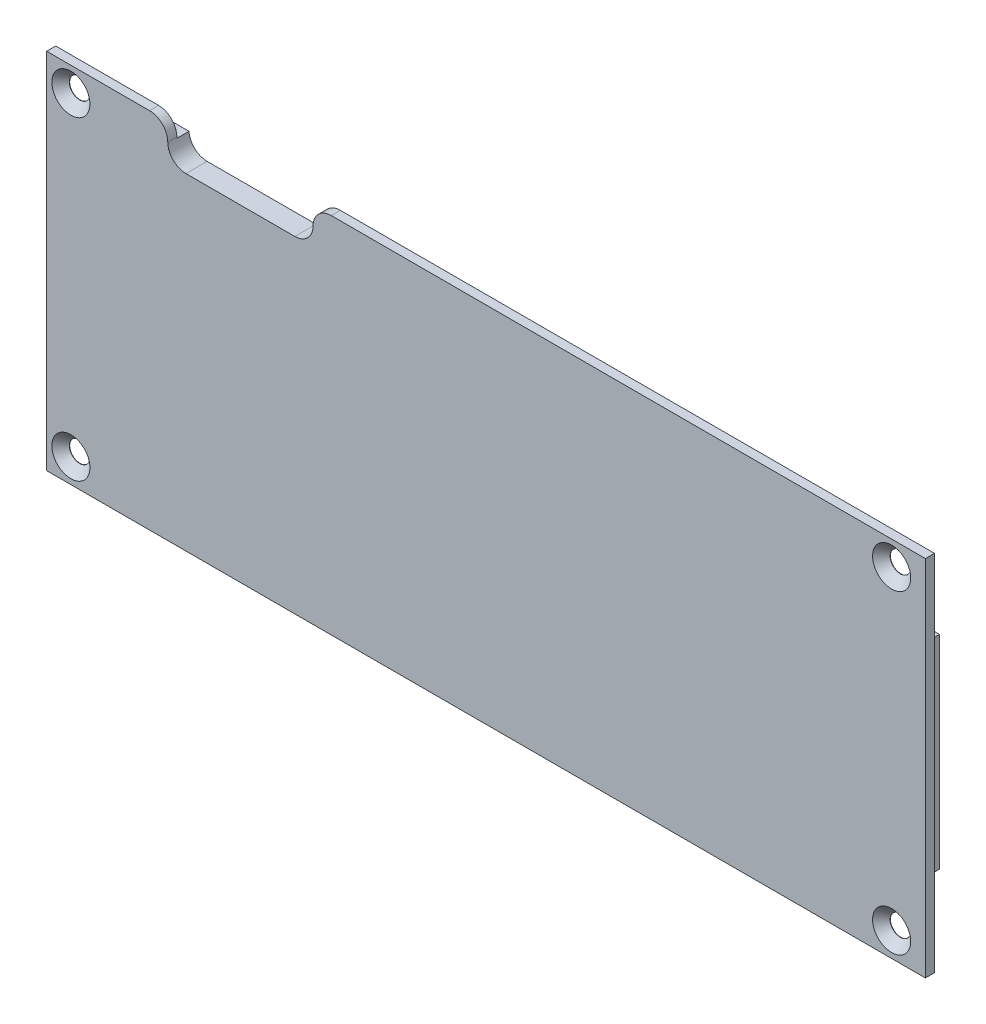
ISO-10303-21;
HEADER;
FILE_DESCRIPTION(('STEP AP214'),'2;1');
FILE_NAME('part.step','',(''),(''),'','','');
FILE_SCHEMA(('AUTOMOTIVE_DESIGN { 1 0 10303 214 1 1 1 1 }'));
ENDSEC;
DATA;
#1=APPLICATION_CONTEXT('core data for automotive mechanical design processes');
#2=APPLICATION_PROTOCOL_DEFINITION('international standard','automotive_design',2000,#1);
#3=PRODUCT_CONTEXT('',#1,'mechanical');
#4=PRODUCT('Part','Part','',(#3));
#5=PRODUCT_RELATED_PRODUCT_CATEGORY('part','',(#4));
#6=PRODUCT_DEFINITION_FORMATION('','',#4);
#7=PRODUCT_DEFINITION_CONTEXT('part definition',#1,'design');
#8=PRODUCT_DEFINITION('design','',#6,#7);
#9=PRODUCT_DEFINITION_SHAPE('','',#8);
#10=(LENGTH_UNIT() NAMED_UNIT(*) SI_UNIT(.MILLI.,.METRE.));
#11=(NAMED_UNIT(*) PLANE_ANGLE_UNIT() SI_UNIT($,.RADIAN.));
#12=(NAMED_UNIT(*) SI_UNIT($,.STERADIAN.) SOLID_ANGLE_UNIT());
#13=UNCERTAINTY_MEASURE_WITH_UNIT(LENGTH_MEASURE(1.E-05),#10,'distance_accuracy_value','');
#14=(GEOMETRIC_REPRESENTATION_CONTEXT(3) GLOBAL_UNCERTAINTY_ASSIGNED_CONTEXT((#13)) GLOBAL_UNIT_ASSIGNED_CONTEXT((#10,
#11,#12)) REPRESENTATION_CONTEXT('',''));
#15=CARTESIAN_POINT('',(0.,0.,0.));
#16=DIRECTION('',(0.,0.,1.));
#17=DIRECTION('',(1.,0.,0.));
#18=AXIS2_PLACEMENT_3D('',#15,#16,#17);
#19=CARTESIAN_POINT('',(61.374098,26.8,-2.));
#20=DIRECTION('',(0.,-1.,0.));
#21=DIRECTION('',(0.,0.,-1.));
#22=AXIS2_PLACEMENT_3D('',#19,#20,#21);
#23=PLANE('',#22);
#24=DIRECTION('',(1.,0.,0.));
#25=VECTOR('',#24,1.);
#26=CARTESIAN_POINT('',(61.374098,26.8,0.));
#27=LINE('',#26,#25);
#28=CARTESIAN_POINT('',(-28.5807720905808,26.8,0.));
#29=VERTEX_POINT('',#28);
#30=CARTESIAN_POINT('',(-9.044098,26.8,0.));
#31=VERTEX_POINT('',#30);
#32=EDGE_CURVE('E316',#29,#31,#27,.T.);
#33=ORIENTED_EDGE('',*,*,#32,.T.);
#34=DIRECTION('',(0.,0.,-1.));
#35=VECTOR('',#34,1.);
#36=CARTESIAN_POINT('',(-9.044098,26.8,60.2079728939615));
#37=LINE('',#36,#35);
#38=CARTESIAN_POINT('',(-9.044098,26.8,-2.));
#39=VERTEX_POINT('',#38);
#40=EDGE_CURVE('E205',#31,#39,#37,.T.);
#41=ORIENTED_EDGE('',*,*,#40,.T.);
#42=DIRECTION('',(1.,0.,0.));
#43=VECTOR('',#42,1.);
#44=CARTESIAN_POINT('',(61.374098,26.8,-2.));
#45=LINE('',#44,#43);
#46=CARTESIAN_POINT('',(-28.5807720905808,26.8,-2.));
#47=VERTEX_POINT('',#46);
#48=EDGE_CURVE('E293',#47,#39,#45,.T.);
#49=ORIENTED_EDGE('',*,*,#48,.F.);
#50=DIRECTION('',(0.,0.,-1.));
#51=VECTOR('',#50,1.);
#52=CARTESIAN_POINT('',(-28.5807720905809,26.8,-2.));
#53=LINE('',#52,#51);
#54=EDGE_CURVE('E401',#47,#29,#53,.F.);
#55=ORIENTED_EDGE('',*,*,#54,.T.);
#56=EDGE_LOOP('',(#33,#41,#49,#55));
#57=FACE_BOUND('',#56,.T.);
#58=ADVANCED_FACE('F37',(#57),#23,.F.);
#59=CARTESIAN_POINT('',(72.574098,30.,1.5));
#60=DIRECTION('',(0.,-1.,0.));
#61=DIRECTION('',(1.,0.,0.));
#62=AXIS2_PLACEMENT_3D('',#59,#60,#61);
#63=PLANE('',#62);
#64=DIRECTION('',(-1.,0.,0.));
#65=VECTOR('',#64,1.);
#66=CARTESIAN_POINT('',(72.574098,30.,1.5));
#67=LINE('',#66,#65);
#68=CARTESIAN_POINT('',(-55.574098,30.,1.5));
#69=VERTEX_POINT('',#68);
#70=CARTESIAN_POINT('',(-72.574098,30.,1.5));
#71=VERTEX_POINT('',#70);
#72=EDGE_CURVE('E353',#69,#71,#67,.T.);
#73=ORIENTED_EDGE('',*,*,#72,.F.);
#74=DIRECTION('',(0.,0.,1.));
#75=VECTOR('',#74,1.);
#76=CARTESIAN_POINT('',(-55.574098,30.,1.5));
#77=LINE('',#76,#75);
#78=CARTESIAN_POINT('',(-55.574098,30.,0.));
#79=VERTEX_POINT('',#78);
#80=EDGE_CURVE('E393',#69,#79,#77,.F.);
#81=ORIENTED_EDGE('',*,*,#80,.T.);
#82=DIRECTION('',(-1.,0.,0.));
#83=VECTOR('',#82,1.);
#84=CARTESIAN_POINT('',(72.574098,30.,0.));
#85=LINE('',#84,#83);
#86=CARTESIAN_POINT('',(-72.574098,30.,0.));
#87=VERTEX_POINT('',#86);
#88=EDGE_CURVE('E364',#79,#87,#85,.T.);
#89=ORIENTED_EDGE('',*,*,#88,.T.);
#90=DIRECTION('',(0.,0.,-1.));
#91=VECTOR('',#90,1.);
#92=CARTESIAN_POINT('',(-72.574098,30.,1.5));
#93=LINE('',#92,#91);
#94=EDGE_CURVE('E357',#71,#87,#93,.T.);
#95=ORIENTED_EDGE('',*,*,#94,.F.);
#96=EDGE_LOOP('',(#73,#81,#89,#95));
#97=FACE_BOUND('',#96,.T.);
#98=ADVANCED_FACE('F432',(#97),#63,.F.);
#99=CARTESIAN_POINT('',(-61.374098,26.8,0.));
#100=VERTEX_POINT('',#99);
#101=CARTESIAN_POINT('',(-52.5674239094191,26.8,0.));
#102=VERTEX_POINT('',#101);
#103=EDGE_CURVE('E313',#100,#102,#27,.T.);
#104=ORIENTED_EDGE('',*,*,#103,.T.);
#105=DIRECTION('',(0.,0.,-1.));
#106=VECTOR('',#105,1.);
#107=CARTESIAN_POINT('',(-52.5674239094192,26.8,0.));
#108=LINE('',#107,#106);
#109=CARTESIAN_POINT('',(-52.5674239094191,26.8,-2.));
#110=VERTEX_POINT('',#109);
#111=EDGE_CURVE('E46',#102,#110,#108,.T.);
#112=ORIENTED_EDGE('',*,*,#111,.T.);
#113=CARTESIAN_POINT('',(-61.374098,26.8,-2.));
#114=VERTEX_POINT('',#113);
#115=EDGE_CURVE('E61',#114,#110,#45,.T.);
#116=ORIENTED_EDGE('',*,*,#115,.F.);
#117=DIRECTION('',(0.,0.,1.));
#118=VECTOR('',#117,1.);
#119=CARTESIAN_POINT('',(-61.374098,26.8,-2.));
#120=LINE('',#119,#118);
#121=EDGE_CURVE('E329',#114,#100,#120,.T.);
#122=ORIENTED_EDGE('',*,*,#121,.T.);
#123=EDGE_LOOP('',(#104,#112,#116,#122));
#124=FACE_BOUND('',#123,.T.);
#125=ADVANCED_FACE('F488',(#124),#23,.F.);
#126=CARTESIAN_POINT('',(0.,0.,0.));
#127=DIRECTION('',(0.,0.,1.));
#128=DIRECTION('',(1.,0.,0.));
#129=AXIS2_PLACEMENT_3D('',#126,#127,#128);
#130=PLANE('',#129);
#131=CARTESIAN_POINT('',(-68.574098,26.,0.));
#132=DIRECTION('',(0.,0.,1.));
#133=DIRECTION('',(1.,0.,0.));
#134=AXIS2_PLACEMENT_3D('',#131,#132,#133);
#135=CIRCLE('',#134,1.69999999999999);
#136=CARTESIAN_POINT('',(-66.874098,26.,0.));
#137=VERTEX_POINT('',#136);
#138=EDGE_CURVE('E247',#137,#137,#135,.T.);
#139=ORIENTED_EDGE('',*,*,#138,.T.);
#140=EDGE_LOOP('',(#139));
#141=FACE_BOUND('',#140,.T.);
#142=CARTESIAN_POINT('',(-68.574098,-26.,0.));
#143=DIRECTION('',(0.,0.,1.));
#144=DIRECTION('',(1.,0.,0.));
#145=AXIS2_PLACEMENT_3D('',#142,#143,#144);
#146=CIRCLE('',#145,1.69999999999999);
#147=CARTESIAN_POINT('',(-66.874098,-26.,0.));
#148=VERTEX_POINT('',#147);
#149=EDGE_CURVE('E256',#148,#148,#146,.T.);
#150=ORIENTED_EDGE('',*,*,#149,.T.);
#151=EDGE_LOOP('',(#150));
#152=FACE_BOUND('',#151,.T.);
#153=CARTESIAN_POINT('',(66.99808,26.,0.));
#154=DIRECTION('',(0.,0.,1.));
#155=DIRECTION('',(1.,0.,0.));
#156=AXIS2_PLACEMENT_3D('',#153,#154,#155);
#157=CIRCLE('',#156,1.69999999999999);
#158=CARTESIAN_POINT('',(68.69808,26.,0.));
#159=VERTEX_POINT('',#158);
#160=EDGE_CURVE('E265',#159,#159,#157,.T.);
#161=ORIENTED_EDGE('',*,*,#160,.T.);
#162=EDGE_LOOP('',(#161));
#163=FACE_BOUND('',#162,.T.);
#164=CARTESIAN_POINT('',(66.99808,-26.,0.));
#165=DIRECTION('',(0.,0.,1.));
#166=DIRECTION('',(1.,0.,0.));
#167=AXIS2_PLACEMENT_3D('',#164,#165,#166);
#168=CIRCLE('',#167,1.69999999999999);
#169=CARTESIAN_POINT('',(68.69808,-26.,0.));
#170=VERTEX_POINT('',#169);
#171=EDGE_CURVE('E274',#170,#170,#168,.T.);
#172=ORIENTED_EDGE('',*,*,#171,.T.);
#173=EDGE_LOOP('',(#172));
#174=FACE_BOUND('',#173,.T.);
#175=ORIENTED_EDGE('',*,*,#32,.F.);
#176=CARTESIAN_POINT('',(-31.574098,27.,0.));
#177=DIRECTION('',(0.,0.,1.));
#178=DIRECTION('',(1.,0.,0.));
#179=AXIS2_PLACEMENT_3D('',#176,#177,#178);
#180=CIRCLE('',#179,3.);
#181=CARTESIAN_POINT('',(-28.574098,27.,0.));
#182=VERTEX_POINT('',#181);
#183=EDGE_CURVE('E404',#29,#182,#180,.T.);
#184=ORIENTED_EDGE('',*,*,#183,.T.);
#185=CARTESIAN_POINT('',(-25.574098,27.,0.));
#186=DIRECTION('',(0.,0.,1.));
#187=DIRECTION('',(1.,0.,0.));
#188=AXIS2_PLACEMENT_3D('',#185,#186,#187);
#189=CIRCLE('',#188,3.);
#190=CARTESIAN_POINT('',(-25.574098,30.,0.));
#191=VERTEX_POINT('',#190);
#192=EDGE_CURVE('E387',#182,#191,#189,.F.);
#193=ORIENTED_EDGE('',*,*,#192,.T.);
#194=CARTESIAN_POINT('',(72.574098,30.,0.));
#195=VERTEX_POINT('',#194);
#196=EDGE_CURVE('E349',#195,#191,#85,.T.);
#197=ORIENTED_EDGE('',*,*,#196,.F.);
#198=DIRECTION('',(0.,1.,0.));
#199=VECTOR('',#198,1.);
#200=CARTESIAN_POINT('',(72.574098,-30.,0.));
#201=LINE('',#200,#199);
#202=CARTESIAN_POINT('',(72.574098,-30.,0.));
#203=VERTEX_POINT('',#202);
#204=EDGE_CURVE('E362',#203,#195,#201,.T.);
#205=ORIENTED_EDGE('',*,*,#204,.F.);
#206=DIRECTION('',(1.,0.,0.));
#207=VECTOR('',#206,1.);
#208=CARTESIAN_POINT('',(72.574098,-30.,0.));
#209=LINE('',#208,#207);
#210=CARTESIAN_POINT('',(-72.574098,-30.,0.));
#211=VERTEX_POINT('',#210);
#212=EDGE_CURVE('E360',#211,#203,#209,.T.);
#213=ORIENTED_EDGE('',*,*,#212,.F.);
#214=DIRECTION('',(0.,-1.,0.));
#215=VECTOR('',#214,1.);
#216=CARTESIAN_POINT('',(-72.574098,-30.,0.));
#217=LINE('',#216,#215);
#218=EDGE_CURVE('E344',#87,#211,#217,.T.);
#219=ORIENTED_EDGE('',*,*,#218,.F.);
#220=ORIENTED_EDGE('',*,*,#88,.F.);
#221=CARTESIAN_POINT('',(-55.574098,27.,0.));
#222=DIRECTION('',(0.,0.,1.));
#223=DIRECTION('',(1.,0.,0.));
#224=AXIS2_PLACEMENT_3D('',#221,#222,#223);
#225=CIRCLE('',#224,3.);
#226=CARTESIAN_POINT('',(-52.574098,27.,0.));
#227=VERTEX_POINT('',#226);
#228=EDGE_CURVE('E385',#79,#227,#225,.F.);
#229=ORIENTED_EDGE('',*,*,#228,.T.);
#230=CARTESIAN_POINT('',(-49.574098,27.,0.));
#231=DIRECTION('',(0.,0.,1.));
#232=DIRECTION('',(1.,0.,0.));
#233=AXIS2_PLACEMENT_3D('',#230,#231,#232);
#234=CIRCLE('',#233,3.);
#235=EDGE_CURVE('E408',#227,#102,#234,.T.);
#236=ORIENTED_EDGE('',*,*,#235,.T.);
#237=ORIENTED_EDGE('',*,*,#103,.F.);
#238=CARTESIAN_POINT('',(-71.374098,26.8,0.));
#239=DIRECTION('',(0.,0.,1.));
#240=DIRECTION('',(-1.,0.,0.));
#241=AXIS2_PLACEMENT_3D('',#238,#239,#240);
#242=CIRCLE('',#241,10.);
#243=CARTESIAN_POINT('',(-71.374098,16.8,0.));
#244=VERTEX_POINT('',#243);
#245=EDGE_CURVE('E309',#244,#100,#242,.T.);
#246=ORIENTED_EDGE('',*,*,#245,.F.);
#247=DIRECTION('',(0.,1.,0.));
#248=VECTOR('',#247,1.);
#249=CARTESIAN_POINT('',(-71.374098,16.8,0.));
#250=LINE('',#249,#248);
#251=CARTESIAN_POINT('',(-71.374098,-16.8,0.));
#252=VERTEX_POINT('',#251);
#253=EDGE_CURVE('E306',#252,#244,#250,.T.);
#254=ORIENTED_EDGE('',*,*,#253,.F.);
#255=CARTESIAN_POINT('',(-71.374098,-26.8,0.));
#256=DIRECTION('',(0.,0.,1.));
#257=DIRECTION('',(-1.,0.,0.));
#258=AXIS2_PLACEMENT_3D('',#255,#256,#257);
#259=CIRCLE('',#258,10.);
#260=CARTESIAN_POINT('',(-61.374098,-26.8,0.));
#261=VERTEX_POINT('',#260);
#262=EDGE_CURVE('E303',#261,#252,#259,.T.);
#263=ORIENTED_EDGE('',*,*,#262,.F.);
#264=DIRECTION('',(-1.,0.,0.));
#265=VECTOR('',#264,1.);
#266=CARTESIAN_POINT('',(-61.374098,-26.8,0.));
#267=LINE('',#266,#265);
#268=CARTESIAN_POINT('',(61.374098,-26.8,0.));
#269=VERTEX_POINT('',#268);
#270=EDGE_CURVE('E300',#269,#261,#267,.T.);
#271=ORIENTED_EDGE('',*,*,#270,.F.);
#272=CARTESIAN_POINT('',(71.374098,-26.8,0.));
#273=DIRECTION('',(0.,0.,1.));
#274=DIRECTION('',(1.,0.,0.));
#275=AXIS2_PLACEMENT_3D('',#272,#273,#274);
#276=CIRCLE('',#275,10.);
#277=CARTESIAN_POINT('',(71.374098,-16.8,0.));
#278=VERTEX_POINT('',#277);
#279=EDGE_CURVE('E277',#278,#269,#276,.T.);
#280=ORIENTED_EDGE('',*,*,#279,.F.);
#281=DIRECTION('',(0.,-1.,0.));
#282=VECTOR('',#281,1.);
#283=CARTESIAN_POINT('',(71.374098,-16.8,0.));
#284=LINE('',#283,#282);
#285=CARTESIAN_POINT('',(71.374098,16.8,0.));
#286=VERTEX_POINT('',#285);
#287=EDGE_CURVE('E282',#286,#278,#284,.T.);
#288=ORIENTED_EDGE('',*,*,#287,.F.);
#289=CARTESIAN_POINT('',(71.374098,26.8,0.));
#290=DIRECTION('',(0.,0.,1.));
#291=DIRECTION('',(-1.,0.,0.));
#292=AXIS2_PLACEMENT_3D('',#289,#290,#291);
#293=CIRCLE('',#292,10.);
#294=CARTESIAN_POINT('',(61.374098,26.8,0.));
#295=VERTEX_POINT('',#294);
#296=EDGE_CURVE('E315',#295,#286,#293,.T.);
#297=ORIENTED_EDGE('',*,*,#296,.F.);
#298=CARTESIAN_POINT('',(35.955902,26.8,0.));
#299=VERTEX_POINT('',#298);
#300=EDGE_CURVE('E312',#299,#295,#27,.T.);
#301=ORIENTED_EDGE('',*,*,#300,.F.);
#302=DIRECTION('',(0.,-1.,0.));
#303=VECTOR('',#302,1.);
#304=CARTESIAN_POINT('',(35.955902,26.8,0.));
#305=LINE('',#304,#303);
#306=CARTESIAN_POINT('',(35.955902,-13.2,0.));
#307=VERTEX_POINT('',#306);
#308=EDGE_CURVE('E220',#299,#307,#305,.T.);
#309=ORIENTED_EDGE('',*,*,#308,.T.);
#310=DIRECTION('',(-1.,0.,0.));
#311=VECTOR('',#310,1.);
#312=CARTESIAN_POINT('',(35.955902,-13.2,0.));
#313=LINE('',#312,#311);
#314=CARTESIAN_POINT('',(-9.04409800000001,-13.2,0.));
#315=VERTEX_POINT('',#314);
#316=EDGE_CURVE('E212',#307,#315,#313,.T.);
#317=ORIENTED_EDGE('',*,*,#316,.T.);
#318=DIRECTION('',(0.,1.,0.));
#319=VECTOR('',#318,1.);
#320=CARTESIAN_POINT('',(-9.044098,26.8,0.));
#321=LINE('',#320,#319);
#322=EDGE_CURVE('E199',#315,#31,#321,.T.);
#323=ORIENTED_EDGE('',*,*,#322,.T.);
#324=EDGE_LOOP('',(#175,#184,#193,#197,#205,#213,#219,#220,#229,#236,#237,#246,#254,#263,#271,
#280,#288,#297,#301,#309,#317,#323));
#325=FACE_BOUND('',#324,.T.);
#326=ADVANCED_FACE('F218',(#141,#152,#163,#174,#325),#130,.F.);
#327=CARTESIAN_POINT('',(-72.574098,-30.,1.5));
#328=DIRECTION('',(1.,0.,0.));
#329=DIRECTION('',(0.,0.,-1.));
#330=AXIS2_PLACEMENT_3D('',#327,#328,#329);
#331=PLANE('',#330);
#332=ORIENTED_EDGE('',*,*,#218,.T.);
#333=DIRECTION('',(0.,0.,-1.));
#334=VECTOR('',#333,1.);
#335=CARTESIAN_POINT('',(-72.574098,-30.,1.5));
#336=LINE('',#335,#334);
#337=CARTESIAN_POINT('',(-72.574098,-30.,1.5));
#338=VERTEX_POINT('',#337);
#339=EDGE_CURVE('E375',#338,#211,#336,.T.);
#340=ORIENTED_EDGE('',*,*,#339,.F.);
#341=DIRECTION('',(0.,-1.,0.));
#342=VECTOR('',#341,1.);
#343=CARTESIAN_POINT('',(-72.574098,-30.,1.5));
#344=LINE('',#343,#342);
#345=EDGE_CURVE('E345',#71,#338,#344,.T.);
#346=ORIENTED_EDGE('',*,*,#345,.F.);
#347=ORIENTED_EDGE('',*,*,#94,.T.);
#348=EDGE_LOOP('',(#332,#340,#346,#347));
#349=FACE_BOUND('',#348,.T.);
#350=ADVANCED_FACE('F435',(#349),#331,.F.);
#351=CARTESIAN_POINT('',(72.574098,-30.,1.5));
#352=DIRECTION('',(0.,1.,0.));
#353=DIRECTION('',(-1.,0.,0.));
#354=AXIS2_PLACEMENT_3D('',#351,#352,#353);
#355=PLANE('',#354);
#356=ORIENTED_EDGE('',*,*,#212,.T.);
#357=DIRECTION('',(0.,0.,-1.));
#358=VECTOR('',#357,1.);
#359=CARTESIAN_POINT('',(72.574098,-30.,1.5));
#360=LINE('',#359,#358);
#361=CARTESIAN_POINT('',(72.574098,-30.,1.5));
#362=VERTEX_POINT('',#361);
#363=EDGE_CURVE('E372',#362,#203,#360,.T.);
#364=ORIENTED_EDGE('',*,*,#363,.F.);
#365=DIRECTION('',(1.,0.,0.));
#366=VECTOR('',#365,1.);
#367=CARTESIAN_POINT('',(72.574098,-30.,1.5));
#368=LINE('',#367,#366);
#369=EDGE_CURVE('E348',#338,#362,#368,.T.);
#370=ORIENTED_EDGE('',*,*,#369,.F.);
#371=ORIENTED_EDGE('',*,*,#339,.T.);
#372=EDGE_LOOP('',(#356,#364,#370,#371));
#373=FACE_BOUND('',#372,.T.);
#374=ADVANCED_FACE('F519',(#373),#355,.F.);
#375=CARTESIAN_POINT('',(72.574098,-30.,1.5));
#376=DIRECTION('',(-1.,0.,0.));
#377=DIRECTION('',(0.,-1.,0.));
#378=AXIS2_PLACEMENT_3D('',#375,#376,#377);
#379=PLANE('',#378);
#380=ORIENTED_EDGE('',*,*,#204,.T.);
#381=DIRECTION('',(0.,0.,-1.));
#382=VECTOR('',#381,1.);
#383=CARTESIAN_POINT('',(72.574098,30.,1.5));
#384=LINE('',#383,#382);
#385=CARTESIAN_POINT('',(72.574098,30.,1.5));
#386=VERTEX_POINT('',#385);
#387=EDGE_CURVE('E369',#386,#195,#384,.T.);
#388=ORIENTED_EDGE('',*,*,#387,.F.);
#389=DIRECTION('',(0.,1.,0.));
#390=VECTOR('',#389,1.);
#391=CARTESIAN_POINT('',(72.574098,-30.,1.5));
#392=LINE('',#391,#390);
#393=EDGE_CURVE('E351',#362,#386,#392,.T.);
#394=ORIENTED_EDGE('',*,*,#393,.F.);
#395=ORIENTED_EDGE('',*,*,#363,.T.);
#396=EDGE_LOOP('',(#380,#388,#394,#395));
#397=FACE_BOUND('',#396,.T.);
#398=ADVANCED_FACE('F516',(#397),#379,.F.);
#399=ORIENTED_EDGE('',*,*,#196,.T.);
#400=DIRECTION('',(0.,0.,1.));
#401=VECTOR('',#400,1.);
#402=CARTESIAN_POINT('',(-25.574098,30.,1.5));
#403=LINE('',#402,#401);
#404=CARTESIAN_POINT('',(-25.574098,30.,1.5));
#405=VERTEX_POINT('',#404);
#406=EDGE_CURVE('E378',#191,#405,#403,.T.);
#407=ORIENTED_EDGE('',*,*,#406,.T.);
#408=EDGE_CURVE('E354',#386,#405,#67,.T.);
#409=ORIENTED_EDGE('',*,*,#408,.F.);
#410=ORIENTED_EDGE('',*,*,#387,.T.);
#411=EDGE_LOOP('',(#399,#407,#409,#410));
#412=FACE_BOUND('',#411,.T.);
#413=ADVANCED_FACE('F499',(#412),#63,.F.);
#414=CARTESIAN_POINT('',(0.,0.,1.5));
#415=DIRECTION('',(0.,0.,1.));
#416=DIRECTION('',(1.,0.,0.));
#417=AXIS2_PLACEMENT_3D('',#414,#415,#416);
#418=PLANE('',#417);
#419=ORIENTED_EDGE('',*,*,#408,.T.);
#420=CARTESIAN_POINT('',(-25.574098,27.,1.5));
#421=DIRECTION('',(0.,0.,1.));
#422=DIRECTION('',(1.,0.,0.));
#423=AXIS2_PLACEMENT_3D('',#420,#421,#422);
#424=CIRCLE('',#423,3.);
#425=CARTESIAN_POINT('',(-28.574098,27.,1.5));
#426=VERTEX_POINT('',#425);
#427=EDGE_CURVE('E383',#405,#426,#424,.T.);
#428=ORIENTED_EDGE('',*,*,#427,.T.);
#429=CARTESIAN_POINT('',(-31.574098,27.,1.5));
#430=DIRECTION('',(0.,0.,1.));
#431=DIRECTION('',(1.,0.,0.));
#432=AXIS2_PLACEMENT_3D('',#429,#430,#431);
#433=CIRCLE('',#432,3.);
#434=CARTESIAN_POINT('',(-31.574098,24.,1.5));
#435=VERTEX_POINT('',#434);
#436=EDGE_CURVE('E396',#426,#435,#433,.F.);
#437=ORIENTED_EDGE('',*,*,#436,.T.);
#438=DIRECTION('',(1.,0.,0.));
#439=VECTOR('',#438,1.);
#440=CARTESIAN_POINT('',(-52.574098,24.,1.5));
#441=LINE('',#440,#439);
#442=CARTESIAN_POINT('',(-49.574098,24.,1.5));
#443=VERTEX_POINT('',#442);
#444=EDGE_CURVE('E238',#443,#435,#441,.T.);
#445=ORIENTED_EDGE('',*,*,#444,.F.);
#446=CARTESIAN_POINT('',(-49.574098,27.,1.5));
#447=DIRECTION('',(0.,0.,1.));
#448=DIRECTION('',(1.,0.,0.));
#449=AXIS2_PLACEMENT_3D('',#446,#447,#448);
#450=CIRCLE('',#449,3.);
#451=CARTESIAN_POINT('',(-52.574098,27.,1.5));
#452=VERTEX_POINT('',#451);
#453=EDGE_CURVE('E406',#443,#452,#450,.F.);
#454=ORIENTED_EDGE('',*,*,#453,.T.);
#455=CARTESIAN_POINT('',(-55.574098,27.,1.5));
#456=DIRECTION('',(0.,0.,1.));
#457=DIRECTION('',(1.,0.,0.));
#458=AXIS2_PLACEMENT_3D('',#455,#456,#457);
#459=CIRCLE('',#458,3.);
#460=EDGE_CURVE('E381',#452,#69,#459,.T.);
#461=ORIENTED_EDGE('',*,*,#460,.T.);
#462=ORIENTED_EDGE('',*,*,#72,.T.);
#463=ORIENTED_EDGE('',*,*,#345,.T.);
#464=ORIENTED_EDGE('',*,*,#369,.T.);
#465=ORIENTED_EDGE('',*,*,#393,.T.);
#466=EDGE_LOOP('',(#419,#428,#437,#445,#454,#461,#462,#463,#464,#465));
#467=FACE_BOUND('',#466,.T.);
#468=CARTESIAN_POINT('',(-68.574098,26.,1.5));
#469=DIRECTION('',(0.,0.,1.));
#470=DIRECTION('',(1.,0.,0.));
#471=AXIS2_PLACEMENT_3D('',#468,#469,#470);
#472=CIRCLE('',#471,3.15);
#473=CARTESIAN_POINT('',(-65.424098,26.,1.5));
#474=VERTEX_POINT('',#473);
#475=EDGE_CURVE('E237',#474,#474,#472,.T.);
#476=ORIENTED_EDGE('',*,*,#475,.F.);
#477=EDGE_LOOP('',(#476));
#478=FACE_BOUND('',#477,.T.);
#479=CARTESIAN_POINT('',(-68.574098,-26.,1.5));
#480=DIRECTION('',(0.,0.,1.));
#481=DIRECTION('',(1.,0.,0.));
#482=AXIS2_PLACEMENT_3D('',#479,#480,#481);
#483=CIRCLE('',#482,3.15);
#484=CARTESIAN_POINT('',(-65.424098,-26.,1.5));
#485=VERTEX_POINT('',#484);
#486=EDGE_CURVE('E250',#485,#485,#483,.T.);
#487=ORIENTED_EDGE('',*,*,#486,.F.);
#488=EDGE_LOOP('',(#487));
#489=FACE_BOUND('',#488,.T.);
#490=CARTESIAN_POINT('',(66.99808,26.,1.5));
#491=DIRECTION('',(0.,0.,1.));
#492=DIRECTION('',(1.,0.,0.));
#493=AXIS2_PLACEMENT_3D('',#490,#491,#492);
#494=CIRCLE('',#493,3.15);
#495=CARTESIAN_POINT('',(70.14808,26.,1.5));
#496=VERTEX_POINT('',#495);
#497=EDGE_CURVE('E259',#496,#496,#494,.T.);
#498=ORIENTED_EDGE('',*,*,#497,.F.);
#499=EDGE_LOOP('',(#498));
#500=FACE_BOUND('',#499,.T.);
#501=CARTESIAN_POINT('',(66.99808,-26.,1.5));
#502=DIRECTION('',(0.,0.,1.));
#503=DIRECTION('',(1.,0.,0.));
#504=AXIS2_PLACEMENT_3D('',#501,#502,#503);
#505=CIRCLE('',#504,3.15);
#506=CARTESIAN_POINT('',(70.14808,-26.,1.5));
#507=VERTEX_POINT('',#506);
#508=EDGE_CURVE('E268',#507,#507,#505,.T.);
#509=ORIENTED_EDGE('',*,*,#508,.F.);
#510=EDGE_LOOP('',(#509));
#511=FACE_BOUND('',#510,.T.);
#512=ADVANCED_FACE('F438',(#467,#478,#489,#500,#511),#418,.T.);
#513=CARTESIAN_POINT('',(71.374098,-26.8,-2.));
#514=DIRECTION('',(0.,0.,1.));
#515=DIRECTION('',(1.,0.,0.));
#516=AXIS2_PLACEMENT_3D('',#513,#514,#515);
#517=CYLINDRICAL_SURFACE('',#516,10.);
#518=ORIENTED_EDGE('',*,*,#279,.T.);
#519=DIRECTION('',(0.,0.,1.));
#520=VECTOR('',#519,1.);
#521=CARTESIAN_POINT('',(61.374098,-26.8,-2.));
#522=LINE('',#521,#520);
#523=CARTESIAN_POINT('',(61.374098,-26.8,-2.));
#524=VERTEX_POINT('',#523);
#525=EDGE_CURVE('E341',#524,#269,#522,.T.);
#526=ORIENTED_EDGE('',*,*,#525,.F.);
#527=CARTESIAN_POINT('',(71.374098,-26.8,-2.));
#528=DIRECTION('',(0.,0.,1.));
#529=DIRECTION('',(1.,0.,0.));
#530=AXIS2_PLACEMENT_3D('',#527,#528,#529);
#531=CIRCLE('',#530,10.);
#532=CARTESIAN_POINT('',(71.374098,-16.8,-2.));
#533=VERTEX_POINT('',#532);
#534=EDGE_CURVE('E278',#533,#524,#531,.T.);
#535=ORIENTED_EDGE('',*,*,#534,.F.);
#536=DIRECTION('',(0.,0.,1.));
#537=VECTOR('',#536,1.);
#538=CARTESIAN_POINT('',(71.374098,-16.8,-2.));
#539=LINE('',#538,#537);
#540=EDGE_CURVE('E297',#533,#278,#539,.T.);
#541=ORIENTED_EDGE('',*,*,#540,.T.);
#542=EDGE_LOOP('',(#518,#526,#535,#541));
#543=FACE_BOUND('',#542,.T.);
#544=ADVANCED_FACE('F472',(#543),#517,.F.);
#545=CARTESIAN_POINT('',(-61.374098,-26.8,-2.));
#546=DIRECTION('',(0.,1.,0.));
#547=DIRECTION('',(0.,0.,1.));
#548=AXIS2_PLACEMENT_3D('',#545,#546,#547);
#549=PLANE('',#548);
#550=ORIENTED_EDGE('',*,*,#270,.T.);
#551=DIRECTION('',(0.,0.,1.));
#552=VECTOR('',#551,1.);
#553=CARTESIAN_POINT('',(-61.374098,-26.8,-2.));
#554=LINE('',#553,#552);
#555=CARTESIAN_POINT('',(-61.374098,-26.8,-2.));
#556=VERTEX_POINT('',#555);
#557=EDGE_CURVE('E338',#556,#261,#554,.T.);
#558=ORIENTED_EDGE('',*,*,#557,.F.);
#559=DIRECTION('',(-1.,0.,0.));
#560=VECTOR('',#559,1.);
#561=CARTESIAN_POINT('',(-61.374098,-26.8,-2.));
#562=LINE('',#561,#560);
#563=EDGE_CURVE('E281',#524,#556,#562,.T.);
#564=ORIENTED_EDGE('',*,*,#563,.F.);
#565=ORIENTED_EDGE('',*,*,#525,.T.);
#566=EDGE_LOOP('',(#550,#558,#564,#565));
#567=FACE_BOUND('',#566,.T.);
#568=ADVANCED_FACE('F474',(#567),#549,.F.);
#569=CARTESIAN_POINT('',(-71.374098,-26.8,-2.));
#570=DIRECTION('',(0.,0.,1.));
#571=DIRECTION('',(1.,0.,0.));
#572=AXIS2_PLACEMENT_3D('',#569,#570,#571);
#573=CYLINDRICAL_SURFACE('',#572,10.);
#574=ORIENTED_EDGE('',*,*,#262,.T.);
#575=DIRECTION('',(0.,0.,1.));
#576=VECTOR('',#575,1.);
#577=CARTESIAN_POINT('',(-71.374098,-16.8,-2.));
#578=LINE('',#577,#576);
#579=CARTESIAN_POINT('',(-71.374098,-16.8,-2.));
#580=VERTEX_POINT('',#579);
#581=EDGE_CURVE('E335',#580,#252,#578,.T.);
#582=ORIENTED_EDGE('',*,*,#581,.F.);
#583=CARTESIAN_POINT('',(-71.374098,-26.8,-2.));
#584=DIRECTION('',(0.,0.,1.));
#585=DIRECTION('',(-1.,0.,0.));
#586=AXIS2_PLACEMENT_3D('',#583,#584,#585);
#587=CIRCLE('',#586,10.);
#588=EDGE_CURVE('E284',#556,#580,#587,.T.);
#589=ORIENTED_EDGE('',*,*,#588,.F.);
#590=ORIENTED_EDGE('',*,*,#557,.T.);
#591=EDGE_LOOP('',(#574,#582,#589,#590));
#592=FACE_BOUND('',#591,.T.);
#593=ADVANCED_FACE('F478',(#592),#573,.F.);
#594=CARTESIAN_POINT('',(-71.374098,16.8,-2.));
#595=DIRECTION('',(1.,0.,0.));
#596=DIRECTION('',(0.,0.,-1.));
#597=AXIS2_PLACEMENT_3D('',#594,#595,#596);
#598=PLANE('',#597);
#599=ORIENTED_EDGE('',*,*,#253,.T.);
#600=DIRECTION('',(0.,0.,1.));
#601=VECTOR('',#600,1.);
#602=CARTESIAN_POINT('',(-71.374098,16.8,-2.));
#603=LINE('',#602,#601);
#604=CARTESIAN_POINT('',(-71.374098,16.8,-2.));
#605=VERTEX_POINT('',#604);
#606=EDGE_CURVE('E332',#605,#244,#603,.T.);
#607=ORIENTED_EDGE('',*,*,#606,.F.);
#608=DIRECTION('',(0.,1.,0.));
#609=VECTOR('',#608,1.);
#610=CARTESIAN_POINT('',(-71.374098,16.8,-2.));
#611=LINE('',#610,#609);
#612=EDGE_CURVE('E286',#580,#605,#611,.T.);
#613=ORIENTED_EDGE('',*,*,#612,.F.);
#614=ORIENTED_EDGE('',*,*,#581,.T.);
#615=EDGE_LOOP('',(#599,#607,#613,#614));
#616=FACE_BOUND('',#615,.T.);
#617=ADVANCED_FACE('F484',(#616),#598,.F.);
#618=CARTESIAN_POINT('',(-71.374098,26.8,-2.));
#619=DIRECTION('',(0.,0.,1.));
#620=DIRECTION('',(1.,0.,0.));
#621=AXIS2_PLACEMENT_3D('',#618,#619,#620);
#622=CYLINDRICAL_SURFACE('',#621,10.);
#623=ORIENTED_EDGE('',*,*,#245,.T.);
#624=ORIENTED_EDGE('',*,*,#121,.F.);
#625=CARTESIAN_POINT('',(-71.374098,26.8,-2.));
#626=DIRECTION('',(0.,0.,1.));
#627=DIRECTION('',(-1.,0.,0.));
#628=AXIS2_PLACEMENT_3D('',#625,#626,#627);
#629=CIRCLE('',#628,10.);
#630=EDGE_CURVE('E288',#605,#114,#629,.T.);
#631=ORIENTED_EDGE('',*,*,#630,.F.);
#632=ORIENTED_EDGE('',*,*,#606,.T.);
#633=EDGE_LOOP('',(#623,#624,#631,#632));
#634=FACE_BOUND('',#633,.T.);
#635=ADVANCED_FACE('F486',(#634),#622,.F.);
#636=CARTESIAN_POINT('',(35.955902,26.8,-2.));
#637=VERTEX_POINT('',#636);
#638=CARTESIAN_POINT('',(61.374098,26.8,-2.));
#639=VERTEX_POINT('',#638);
#640=EDGE_CURVE('E290',#637,#639,#45,.T.);
#641=ORIENTED_EDGE('',*,*,#640,.F.);
#642=DIRECTION('',(0.,0.,-1.));
#643=VECTOR('',#642,1.);
#644=CARTESIAN_POINT('',(35.955902,26.8,60.2079728939615));
#645=LINE('',#644,#643);
#646=EDGE_CURVE('E54',#299,#637,#645,.T.);
#647=ORIENTED_EDGE('',*,*,#646,.F.);
#648=ORIENTED_EDGE('',*,*,#300,.T.);
#649=DIRECTION('',(0.,0.,1.));
#650=VECTOR('',#649,1.);
#651=CARTESIAN_POINT('',(61.374098,26.8,-2.));
#652=LINE('',#651,#650);
#653=EDGE_CURVE('E326',#639,#295,#652,.T.);
#654=ORIENTED_EDGE('',*,*,#653,.F.);
#655=EDGE_LOOP('',(#641,#647,#648,#654));
#656=FACE_BOUND('',#655,.T.);
#657=ADVANCED_FACE('F460',(#656),#23,.F.);
#658=CARTESIAN_POINT('',(71.374098,26.8,-2.));
#659=DIRECTION('',(0.,0.,1.));
#660=DIRECTION('',(1.,0.,0.));
#661=AXIS2_PLACEMENT_3D('',#658,#659,#660);
#662=CYLINDRICAL_SURFACE('',#661,10.);
#663=ORIENTED_EDGE('',*,*,#296,.T.);
#664=DIRECTION('',(0.,0.,1.));
#665=VECTOR('',#664,1.);
#666=CARTESIAN_POINT('',(71.374098,16.8,-2.));
#667=LINE('',#666,#665);
#668=CARTESIAN_POINT('',(71.374098,16.8,-2.));
#669=VERTEX_POINT('',#668);
#670=EDGE_CURVE('E323',#669,#286,#667,.T.);
#671=ORIENTED_EDGE('',*,*,#670,.F.);
#672=CARTESIAN_POINT('',(71.374098,26.8,-2.));
#673=DIRECTION('',(0.,0.,1.));
#674=DIRECTION('',(-1.,0.,0.));
#675=AXIS2_PLACEMENT_3D('',#672,#673,#674);
#676=CIRCLE('',#675,10.);
#677=EDGE_CURVE('E292',#639,#669,#676,.T.);
#678=ORIENTED_EDGE('',*,*,#677,.F.);
#679=ORIENTED_EDGE('',*,*,#653,.T.);
#680=EDGE_LOOP('',(#663,#671,#678,#679));
#681=FACE_BOUND('',#680,.T.);
#682=ADVANCED_FACE('F463',(#681),#662,.F.);
#683=CARTESIAN_POINT('',(71.374098,-16.8,-2.));
#684=DIRECTION('',(-1.,0.,0.));
#685=DIRECTION('',(0.,0.,1.));
#686=AXIS2_PLACEMENT_3D('',#683,#684,#685);
#687=PLANE('',#686);
#688=ORIENTED_EDGE('',*,*,#287,.T.);
#689=ORIENTED_EDGE('',*,*,#540,.F.);
#690=DIRECTION('',(0.,-1.,0.));
#691=VECTOR('',#690,1.);
#692=CARTESIAN_POINT('',(71.374098,-16.8,-2.));
#693=LINE('',#692,#691);
#694=EDGE_CURVE('E295',#669,#533,#693,.T.);
#695=ORIENTED_EDGE('',*,*,#694,.F.);
#696=ORIENTED_EDGE('',*,*,#670,.T.);
#697=EDGE_LOOP('',(#688,#689,#695,#696));
#698=FACE_BOUND('',#697,.T.);
#699=ADVANCED_FACE('F467',(#698),#687,.F.);
#700=CARTESIAN_POINT('',(71.374098,-26.8,-2.));
#701=DIRECTION('',(0.,0.,1.));
#702=DIRECTION('',(1.,0.,0.));
#703=AXIS2_PLACEMENT_3D('',#700,#701,#702);
#704=PLANE('',#703);
#705=ORIENTED_EDGE('',*,*,#48,.T.);
#706=DIRECTION('',(0.,1.,0.));
#707=VECTOR('',#706,1.);
#708=CARTESIAN_POINT('',(-9.044098,26.8,-2.));
#709=LINE('',#708,#707);
#710=CARTESIAN_POINT('',(-9.04409800000001,-13.2,-2.));
#711=VERTEX_POINT('',#710);
#712=EDGE_CURVE('E222',#711,#39,#709,.T.);
#713=ORIENTED_EDGE('',*,*,#712,.F.);
#714=DIRECTION('',(-1.,0.,0.));
#715=VECTOR('',#714,1.);
#716=CARTESIAN_POINT('',(35.955902,-13.2,-2.));
#717=LINE('',#716,#715);
#718=CARTESIAN_POINT('',(35.955902,-13.2,-2.));
#719=VERTEX_POINT('',#718);
#720=EDGE_CURVE('E215',#719,#711,#717,.T.);
#721=ORIENTED_EDGE('',*,*,#720,.F.);
#722=DIRECTION('',(0.,-1.,0.));
#723=VECTOR('',#722,1.);
#724=CARTESIAN_POINT('',(35.955902,26.8,-2.));
#725=LINE('',#724,#723);
#726=EDGE_CURVE('E227',#637,#719,#725,.T.);
#727=ORIENTED_EDGE('',*,*,#726,.F.);
#728=ORIENTED_EDGE('',*,*,#640,.T.);
#729=ORIENTED_EDGE('',*,*,#677,.T.);
#730=ORIENTED_EDGE('',*,*,#694,.T.);
#731=ORIENTED_EDGE('',*,*,#534,.T.);
#732=ORIENTED_EDGE('',*,*,#563,.T.);
#733=ORIENTED_EDGE('',*,*,#588,.T.);
#734=ORIENTED_EDGE('',*,*,#612,.T.);
#735=ORIENTED_EDGE('',*,*,#630,.T.);
#736=ORIENTED_EDGE('',*,*,#115,.T.);
#737=CARTESIAN_POINT('',(-49.574098,27.,-2.));
#738=DIRECTION('',(0.,0.,1.));
#739=DIRECTION('',(1.,0.,0.));
#740=AXIS2_PLACEMENT_3D('',#737,#738,#739);
#741=CIRCLE('',#740,3.);
#742=CARTESIAN_POINT('',(-49.574098,24.,-2.));
#743=VERTEX_POINT('',#742);
#744=EDGE_CURVE('E11',#110,#743,#741,.T.);
#745=ORIENTED_EDGE('',*,*,#744,.T.);
#746=DIRECTION('',(1.,0.,0.));
#747=VECTOR('',#746,1.);
#748=CARTESIAN_POINT('',(-52.574098,24.,-2.));
#749=LINE('',#748,#747);
#750=CARTESIAN_POINT('',(-31.574098,24.,-2.));
#751=VERTEX_POINT('',#750);
#752=EDGE_CURVE('E234',#743,#751,#749,.T.);
#753=ORIENTED_EDGE('',*,*,#752,.T.);
#754=CARTESIAN_POINT('',(-31.574098,27.,-2.));
#755=DIRECTION('',(0.,0.,1.));
#756=DIRECTION('',(1.,0.,0.));
#757=AXIS2_PLACEMENT_3D('',#754,#755,#756);
#758=CIRCLE('',#757,3.);
#759=EDGE_CURVE('E398',#751,#47,#758,.T.);
#760=ORIENTED_EDGE('',*,*,#759,.T.);
#761=EDGE_LOOP('',(#705,#713,#721,#727,#728,#729,#730,#731,#732,#733,#734,#735,#736,#745,#753,#760));
#762=FACE_BOUND('',#761,.T.);
#763=ADVANCED_FACE('F453',(#762),#704,.F.);
#764=CARTESIAN_POINT('',(66.99808,-26.,1.5));
#765=DIRECTION('',(0.,0.,1.));
#766=DIRECTION('',(1.,0.,0.));
#767=AXIS2_PLACEMENT_3D('',#764,#765,#766);
#768=CYLINDRICAL_SURFACE('',#767,1.69999999999999);
#769=ORIENTED_EDGE('',*,*,#171,.F.);
#770=EDGE_LOOP('',(#769));
#771=FACE_BOUND('',#770,.T.);
#772=CARTESIAN_POINT('',(66.99808,-26.,0.0500000000000006));
#773=DIRECTION('',(0.,0.,1.));
#774=DIRECTION('',(1.,0.,0.));
#775=AXIS2_PLACEMENT_3D('',#772,#773,#774);
#776=CIRCLE('',#775,1.69999999999999);
#777=CARTESIAN_POINT('',(68.69808,-26.,0.0500000000000006));
#778=VERTEX_POINT('',#777);
#779=EDGE_CURVE('E271',#778,#778,#776,.T.);
#780=ORIENTED_EDGE('',*,*,#779,.T.);
#781=EDGE_LOOP('',(#780));
#782=FACE_BOUND('',#781,.T.);
#783=ADVANCED_FACE('F610',(#771,#782),#768,.F.);
#784=CARTESIAN_POINT('',(66.99808,-26.,1.5));
#785=DIRECTION('',(0.,0.,1.));
#786=DIRECTION('',(1.,0.,0.));
#787=AXIS2_PLACEMENT_3D('',#784,#785,#786);
#788=CONICAL_SURFACE('',#787,3.15,0.78539816339745);
#789=ORIENTED_EDGE('',*,*,#779,.F.);
#790=EDGE_LOOP('',(#789));
#791=FACE_BOUND('',#790,.T.);
#792=ORIENTED_EDGE('',*,*,#508,.T.);
#793=EDGE_LOOP('',(#792));
#794=FACE_BOUND('',#793,.T.);
#795=ADVANCED_FACE('F602',(#791,#794),#788,.F.);
#796=CARTESIAN_POINT('',(66.99808,26.,1.5));
#797=DIRECTION('',(0.,0.,1.));
#798=DIRECTION('',(1.,0.,0.));
#799=AXIS2_PLACEMENT_3D('',#796,#797,#798);
#800=CYLINDRICAL_SURFACE('',#799,1.69999999999999);
#801=ORIENTED_EDGE('',*,*,#160,.F.);
#802=EDGE_LOOP('',(#801));
#803=FACE_BOUND('',#802,.T.);
#804=CARTESIAN_POINT('',(66.99808,26.,0.0500000000000006));
#805=DIRECTION('',(0.,0.,1.));
#806=DIRECTION('',(1.,0.,0.));
#807=AXIS2_PLACEMENT_3D('',#804,#805,#806);
#808=CIRCLE('',#807,1.69999999999999);
#809=CARTESIAN_POINT('',(68.69808,26.,0.0500000000000006));
#810=VERTEX_POINT('',#809);
#811=EDGE_CURVE('E262',#810,#810,#808,.T.);
#812=ORIENTED_EDGE('',*,*,#811,.T.);
#813=EDGE_LOOP('',(#812));
#814=FACE_BOUND('',#813,.T.);
#815=ADVANCED_FACE('F594',(#803,#814),#800,.F.);
#816=CARTESIAN_POINT('',(66.99808,26.,1.5));
#817=DIRECTION('',(0.,0.,1.));
#818=DIRECTION('',(1.,0.,0.));
#819=AXIS2_PLACEMENT_3D('',#816,#817,#818);
#820=CONICAL_SURFACE('',#819,3.15,0.78539816339745);
#821=ORIENTED_EDGE('',*,*,#811,.F.);
#822=EDGE_LOOP('',(#821));
#823=FACE_BOUND('',#822,.T.);
#824=ORIENTED_EDGE('',*,*,#497,.T.);
#825=EDGE_LOOP('',(#824));
#826=FACE_BOUND('',#825,.T.);
#827=ADVANCED_FACE('F586',(#823,#826),#820,.F.);
#828=CARTESIAN_POINT('',(-68.574098,-26.,1.5));
#829=DIRECTION('',(0.,0.,1.));
#830=DIRECTION('',(1.,0.,0.));
#831=AXIS2_PLACEMENT_3D('',#828,#829,#830);
#832=CYLINDRICAL_SURFACE('',#831,1.69999999999999);
#833=ORIENTED_EDGE('',*,*,#149,.F.);
#834=EDGE_LOOP('',(#833));
#835=FACE_BOUND('',#834,.T.);
#836=CARTESIAN_POINT('',(-68.574098,-26.,0.0500000000000006));
#837=DIRECTION('',(0.,0.,1.));
#838=DIRECTION('',(1.,0.,0.));
#839=AXIS2_PLACEMENT_3D('',#836,#837,#838);
#840=CIRCLE('',#839,1.69999999999999);
#841=CARTESIAN_POINT('',(-66.874098,-26.,0.0500000000000006));
#842=VERTEX_POINT('',#841);
#843=EDGE_CURVE('E253',#842,#842,#840,.T.);
#844=ORIENTED_EDGE('',*,*,#843,.T.);
#845=EDGE_LOOP('',(#844));
#846=FACE_BOUND('',#845,.T.);
#847=ADVANCED_FACE('F578',(#835,#846),#832,.F.);
#848=CARTESIAN_POINT('',(-68.574098,-26.,1.5));
#849=DIRECTION('',(0.,0.,1.));
#850=DIRECTION('',(1.,0.,0.));
#851=AXIS2_PLACEMENT_3D('',#848,#849,#850);
#852=CONICAL_SURFACE('',#851,3.15,0.78539816339745);
#853=ORIENTED_EDGE('',*,*,#843,.F.);
#854=EDGE_LOOP('',(#853));
#855=FACE_BOUND('',#854,.T.);
#856=ORIENTED_EDGE('',*,*,#486,.T.);
#857=EDGE_LOOP('',(#856));
#858=FACE_BOUND('',#857,.T.);
#859=ADVANCED_FACE('F570',(#855,#858),#852,.F.);
#860=CARTESIAN_POINT('',(-68.574098,26.,1.5));
#861=DIRECTION('',(0.,0.,1.));
#862=DIRECTION('',(1.,0.,0.));
#863=AXIS2_PLACEMENT_3D('',#860,#861,#862);
#864=CYLINDRICAL_SURFACE('',#863,1.69999999999999);
#865=ORIENTED_EDGE('',*,*,#138,.F.);
#866=EDGE_LOOP('',(#865));
#867=FACE_BOUND('',#866,.T.);
#868=CARTESIAN_POINT('',(-68.574098,26.,0.0500000000000006));
#869=DIRECTION('',(0.,0.,1.));
#870=DIRECTION('',(1.,0.,0.));
#871=AXIS2_PLACEMENT_3D('',#868,#869,#870);
#872=CIRCLE('',#871,1.69999999999999);
#873=CARTESIAN_POINT('',(-66.874098,26.,0.0500000000000006));
#874=VERTEX_POINT('',#873);
#875=EDGE_CURVE('E244',#874,#874,#872,.T.);
#876=ORIENTED_EDGE('',*,*,#875,.T.);
#877=EDGE_LOOP('',(#876));
#878=FACE_BOUND('',#877,.T.);
#879=ADVANCED_FACE('F561',(#867,#878),#864,.F.);
#880=CARTESIAN_POINT('',(-68.574098,26.,1.5));
#881=DIRECTION('',(0.,0.,1.));
#882=DIRECTION('',(1.,0.,0.));
#883=AXIS2_PLACEMENT_3D('',#880,#881,#882);
#884=CONICAL_SURFACE('',#883,3.15,0.78539816339745);
#885=ORIENTED_EDGE('',*,*,#875,.F.);
#886=EDGE_LOOP('',(#885));
#887=FACE_BOUND('',#886,.T.);
#888=ORIENTED_EDGE('',*,*,#475,.T.);
#889=EDGE_LOOP('',(#888));
#890=FACE_BOUND('',#889,.T.);
#891=ADVANCED_FACE('F553',(#887,#890),#884,.F.);
#892=CARTESIAN_POINT('',(-52.574098,24.,-2.));
#893=DIRECTION('',(0.,-1.,0.));
#894=DIRECTION('',(0.,0.,-1.));
#895=AXIS2_PLACEMENT_3D('',#892,#893,#894);
#896=PLANE('',#895);
#897=ORIENTED_EDGE('',*,*,#444,.T.);
#898=DIRECTION('',(0.,0.,1.));
#899=VECTOR('',#898,1.);
#900=CARTESIAN_POINT('',(-31.574098,24.,-2.));
#901=LINE('',#900,#899);
#902=EDGE_CURVE('E391',#435,#751,#901,.F.);
#903=ORIENTED_EDGE('',*,*,#902,.T.);
#904=ORIENTED_EDGE('',*,*,#752,.F.);
#905=DIRECTION('',(0.,0.,1.));
#906=VECTOR('',#905,1.);
#907=CARTESIAN_POINT('',(-49.574098,24.,1.5));
#908=LINE('',#907,#906);
#909=EDGE_CURVE('E389',#743,#443,#908,.T.);
#910=ORIENTED_EDGE('',*,*,#909,.T.);
#911=EDGE_LOOP('',(#897,#903,#904,#910));
#912=FACE_BOUND('',#911,.T.);
#913=ADVANCED_FACE('F445',(#912),#896,.F.);
#914=CARTESIAN_POINT('',(-31.574098,27.,-2.));
#915=DIRECTION('',(0.,0.,-1.));
#916=DIRECTION('',(-1.,0.,0.));
#917=AXIS2_PLACEMENT_3D('',#914,#915,#916);
#918=CYLINDRICAL_SURFACE('',#917,3.);
#919=DIRECTION('',(0.,0.,1.));
#920=VECTOR('',#919,1.);
#921=CARTESIAN_POINT('',(-28.574098,27.,1.5));
#922=LINE('',#921,#920);
#923=EDGE_CURVE('E241',#182,#426,#922,.T.);
#924=ORIENTED_EDGE('',*,*,#923,.F.);
#925=ORIENTED_EDGE('',*,*,#183,.F.);
#926=ORIENTED_EDGE('',*,*,#54,.F.);
#927=ORIENTED_EDGE('',*,*,#759,.F.);
#928=ORIENTED_EDGE('',*,*,#902,.F.);
#929=ORIENTED_EDGE('',*,*,#436,.F.);
#930=EDGE_LOOP('',(#924,#925,#926,#927,#928,#929));
#931=FACE_BOUND('',#930,.T.);
#932=ADVANCED_FACE('F449',(#931),#918,.F.);
#933=CARTESIAN_POINT('',(-25.574098,27.,1.5));
#934=DIRECTION('',(0.,0.,1.));
#935=DIRECTION('',(1.,0.,0.));
#936=AXIS2_PLACEMENT_3D('',#933,#934,#935);
#937=CYLINDRICAL_SURFACE('',#936,3.);
#938=ORIENTED_EDGE('',*,*,#192,.F.);
#939=ORIENTED_EDGE('',*,*,#923,.T.);
#940=ORIENTED_EDGE('',*,*,#427,.F.);
#941=ORIENTED_EDGE('',*,*,#406,.F.);
#942=EDGE_LOOP('',(#938,#939,#940,#941));
#943=FACE_BOUND('',#942,.T.);
#944=ADVANCED_FACE('F510',(#943),#937,.T.);
#945=CARTESIAN_POINT('',(-49.574098,27.,-2.));
#946=DIRECTION('',(0.,0.,-1.));
#947=DIRECTION('',(-1.,0.,0.));
#948=AXIS2_PLACEMENT_3D('',#945,#946,#947);
#949=CYLINDRICAL_SURFACE('',#948,3.);
#950=ORIENTED_EDGE('',*,*,#111,.F.);
#951=ORIENTED_EDGE('',*,*,#235,.F.);
#952=DIRECTION('',(0.,0.,1.));
#953=VECTOR('',#952,1.);
#954=CARTESIAN_POINT('',(-52.574098,27.,-2.));
#955=LINE('',#954,#953);
#956=EDGE_CURVE('E41',#452,#227,#955,.F.);
#957=ORIENTED_EDGE('',*,*,#956,.F.);
#958=ORIENTED_EDGE('',*,*,#453,.F.);
#959=ORIENTED_EDGE('',*,*,#909,.F.);
#960=ORIENTED_EDGE('',*,*,#744,.F.);
#961=EDGE_LOOP('',(#950,#951,#957,#958,#959,#960));
#962=FACE_BOUND('',#961,.T.);
#963=ADVANCED_FACE('F39',(#962),#949,.F.);
#964=CARTESIAN_POINT('',(-55.574098,27.,-2.));
#965=DIRECTION('',(0.,0.,1.));
#966=DIRECTION('',(1.,0.,0.));
#967=AXIS2_PLACEMENT_3D('',#964,#965,#966);
#968=CYLINDRICAL_SURFACE('',#967,3.);
#969=ORIENTED_EDGE('',*,*,#228,.F.);
#970=ORIENTED_EDGE('',*,*,#80,.F.);
#971=ORIENTED_EDGE('',*,*,#460,.F.);
#972=ORIENTED_EDGE('',*,*,#956,.T.);
#973=EDGE_LOOP('',(#969,#970,#971,#972));
#974=FACE_BOUND('',#973,.T.);
#975=ADVANCED_FACE('F419',(#974),#968,.T.);
#976=CARTESIAN_POINT('',(35.955902,-13.2,60.2079728939615));
#977=DIRECTION('',(0.,-1.,0.));
#978=DIRECTION('',(0.,0.,-1.));
#979=AXIS2_PLACEMENT_3D('',#976,#977,#978);
#980=PLANE('',#979);
#981=DIRECTION('',(0.,0.,-1.));
#982=VECTOR('',#981,1.);
#983=CARTESIAN_POINT('',(35.955902,-13.2,60.2079728939615));
#984=LINE('',#983,#982);
#985=EDGE_CURVE('E229',#307,#719,#984,.T.);
#986=ORIENTED_EDGE('',*,*,#985,.T.);
#987=ORIENTED_EDGE('',*,*,#720,.T.);
#988=DIRECTION('',(0.,0.,-1.));
#989=VECTOR('',#988,1.);
#990=CARTESIAN_POINT('',(-9.04409800000001,-13.2,60.2079728939615));
#991=LINE('',#990,#989);
#992=EDGE_CURVE('E202',#315,#711,#991,.T.);
#993=ORIENTED_EDGE('',*,*,#992,.F.);
#994=ORIENTED_EDGE('',*,*,#316,.F.);
#995=EDGE_LOOP('',(#986,#987,#993,#994));
#996=FACE_BOUND('',#995,.T.);
#997=ADVANCED_FACE('F211',(#996),#980,.F.);
#998=CARTESIAN_POINT('',(-9.044098,26.8,60.2079728939615));
#999=DIRECTION('',(-1.,0.,0.));
#1000=DIRECTION('',(0.,-1.,0.));
#1001=AXIS2_PLACEMENT_3D('',#998,#999,#1000);
#1002=PLANE('',#1001);
#1003=ORIENTED_EDGE('',*,*,#992,.T.);
#1004=ORIENTED_EDGE('',*,*,#712,.T.);
#1005=ORIENTED_EDGE('',*,*,#40,.F.);
#1006=ORIENTED_EDGE('',*,*,#322,.F.);
#1007=EDGE_LOOP('',(#1003,#1004,#1005,#1006));
#1008=FACE_BOUND('',#1007,.T.);
#1009=ADVANCED_FACE('F201',(#1008),#1002,.F.);
#1010=CARTESIAN_POINT('',(35.955902,26.8,60.2079728939615));
#1011=DIRECTION('',(1.,0.,0.));
#1012=DIRECTION('',(0.,1.,0.));
#1013=AXIS2_PLACEMENT_3D('',#1010,#1011,#1012);
#1014=PLANE('',#1013);
#1015=ORIENTED_EDGE('',*,*,#646,.T.);
#1016=ORIENTED_EDGE('',*,*,#726,.T.);
#1017=ORIENTED_EDGE('',*,*,#985,.F.);
#1018=ORIENTED_EDGE('',*,*,#308,.F.);
#1019=EDGE_LOOP('',(#1015,#1016,#1017,#1018));
#1020=FACE_BOUND('',#1019,.T.);
#1021=ADVANCED_FACE('F835',(#1020),#1014,.F.);
#1022=CLOSED_SHELL('',(#58,#98,#125,#326,#350,#374,#398,#413,#512,#544,#568,#593,#617,#635,#657,
#682,#699,#763,#783,#795,#815,#827,#847,#859,#879,#891,#913,#932,#944,#963,#975,#997,#1009,#1021));
#1023=MANIFOLD_SOLID_BREP('B2',#1022);
#1024=ADVANCED_BREP_SHAPE_REPRESENTATION('',(#18,#1023),#14);
#1025=SHAPE_DEFINITION_REPRESENTATION(#9,#1024);
ENDSEC;
END-ISO-10303-21;
